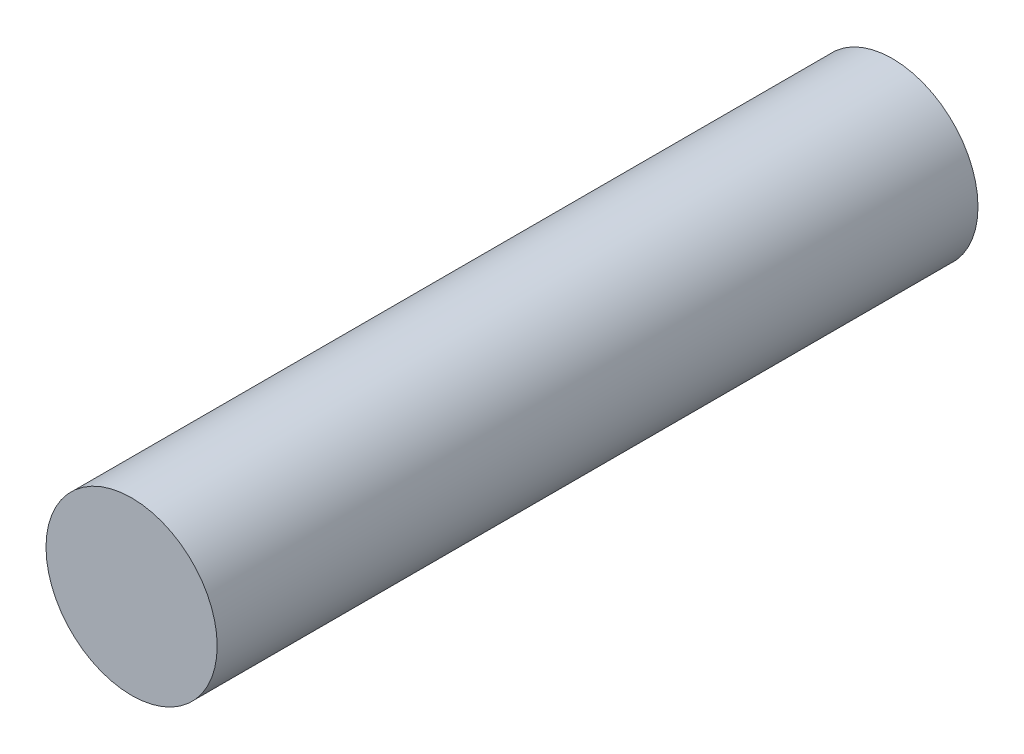
ISO-10303-21;
HEADER;
FILE_DESCRIPTION(('STEP AP214'),'2;1');
FILE_NAME('part.step','',(''),(''),'','','');
FILE_SCHEMA(('AUTOMOTIVE_DESIGN { 1 0 10303 214 1 1 1 1 }'));
ENDSEC;
DATA;
#1=APPLICATION_CONTEXT('core data for automotive mechanical design processes');
#2=APPLICATION_PROTOCOL_DEFINITION('international standard','automotive_design',2000,#1);
#3=PRODUCT_CONTEXT('',#1,'mechanical');
#4=PRODUCT('Part','Part','',(#3));
#5=PRODUCT_RELATED_PRODUCT_CATEGORY('part','',(#4));
#6=PRODUCT_DEFINITION_FORMATION('','',#4);
#7=PRODUCT_DEFINITION_CONTEXT('part definition',#1,'design');
#8=PRODUCT_DEFINITION('design','',#6,#7);
#9=PRODUCT_DEFINITION_SHAPE('','',#8);
#10=(LENGTH_UNIT() NAMED_UNIT(*) SI_UNIT(.MILLI.,.METRE.));
#11=(NAMED_UNIT(*) PLANE_ANGLE_UNIT() SI_UNIT($,.RADIAN.));
#12=(NAMED_UNIT(*) SI_UNIT($,.STERADIAN.) SOLID_ANGLE_UNIT());
#13=UNCERTAINTY_MEASURE_WITH_UNIT(LENGTH_MEASURE(1.E-05),#10,'distance_accuracy_value','');
#14=(GEOMETRIC_REPRESENTATION_CONTEXT(3) GLOBAL_UNCERTAINTY_ASSIGNED_CONTEXT((#13)) GLOBAL_UNIT_ASSIGNED_CONTEXT((#10,
#11,#12)) REPRESENTATION_CONTEXT('',''));
#15=CARTESIAN_POINT('',(0.,0.,0.));
#16=DIRECTION('',(0.,0.,1.));
#17=DIRECTION('',(1.,0.,0.));
#18=AXIS2_PLACEMENT_3D('',#15,#16,#17);
#19=CARTESIAN_POINT('',(0.,0.,80.));
#20=DIRECTION('',(0.,0.,-1.));
#21=DIRECTION('',(-1.,0.,0.));
#22=AXIS2_PLACEMENT_3D('',#19,#20,#21);
#23=CYLINDRICAL_SURFACE('',#22,9.);
#24=CARTESIAN_POINT('',(0.,0.,80.));
#25=DIRECTION('',(0.,0.,1.));
#26=DIRECTION('',(1.,0.,0.));
#27=AXIS2_PLACEMENT_3D('',#24,#25,#26);
#28=CIRCLE('',#27,9.);
#29=CARTESIAN_POINT('',(9.,0.,80.));
#30=VERTEX_POINT('',#29);
#31=EDGE_CURVE('E10',#30,#30,#28,.T.);
#32=ORIENTED_EDGE('',*,*,#31,.F.);
#33=EDGE_LOOP('',(#32));
#34=FACE_BOUND('',#33,.T.);
#35=CARTESIAN_POINT('',(0.,0.,0.));
#36=DIRECTION('',(0.,0.,1.));
#37=DIRECTION('',(1.,0.,0.));
#38=AXIS2_PLACEMENT_3D('',#35,#36,#37);
#39=CIRCLE('',#38,9.);
#40=CARTESIAN_POINT('',(9.,0.,0.));
#41=VERTEX_POINT('',#40);
#42=EDGE_CURVE('E46',#41,#41,#39,.T.);
#43=ORIENTED_EDGE('',*,*,#42,.T.);
#44=EDGE_LOOP('',(#43));
#45=FACE_BOUND('',#44,.T.);
#46=ADVANCED_FACE('F43',(#34,#45),#23,.T.);
#47=CARTESIAN_POINT('',(0.,0.,80.));
#48=DIRECTION('',(0.,0.,1.));
#49=DIRECTION('',(1.,0.,0.));
#50=AXIS2_PLACEMENT_3D('',#47,#48,#49);
#51=PLANE('',#50);
#52=ORIENTED_EDGE('',*,*,#31,.T.);
#53=EDGE_LOOP('',(#52));
#54=FACE_BOUND('',#53,.T.);
#55=ADVANCED_FACE('F58',(#54),#51,.T.);
#56=CARTESIAN_POINT('',(0.,0.,0.));
#57=DIRECTION('',(0.,0.,1.));
#58=DIRECTION('',(1.,0.,0.));
#59=AXIS2_PLACEMENT_3D('',#56,#57,#58);
#60=PLANE('',#59);
#61=ORIENTED_EDGE('',*,*,#42,.F.);
#62=EDGE_LOOP('',(#61));
#63=FACE_BOUND('',#62,.T.);
#64=ADVANCED_FACE('F56',(#63),#60,.F.);
#65=CLOSED_SHELL('',(#46,#55,#64));
#66=MANIFOLD_SOLID_BREP('B2',#65);
#67=ADVANCED_BREP_SHAPE_REPRESENTATION('',(#18,#66),#14);
#68=SHAPE_DEFINITION_REPRESENTATION(#9,#67);
ENDSEC;
END-ISO-10303-21;
